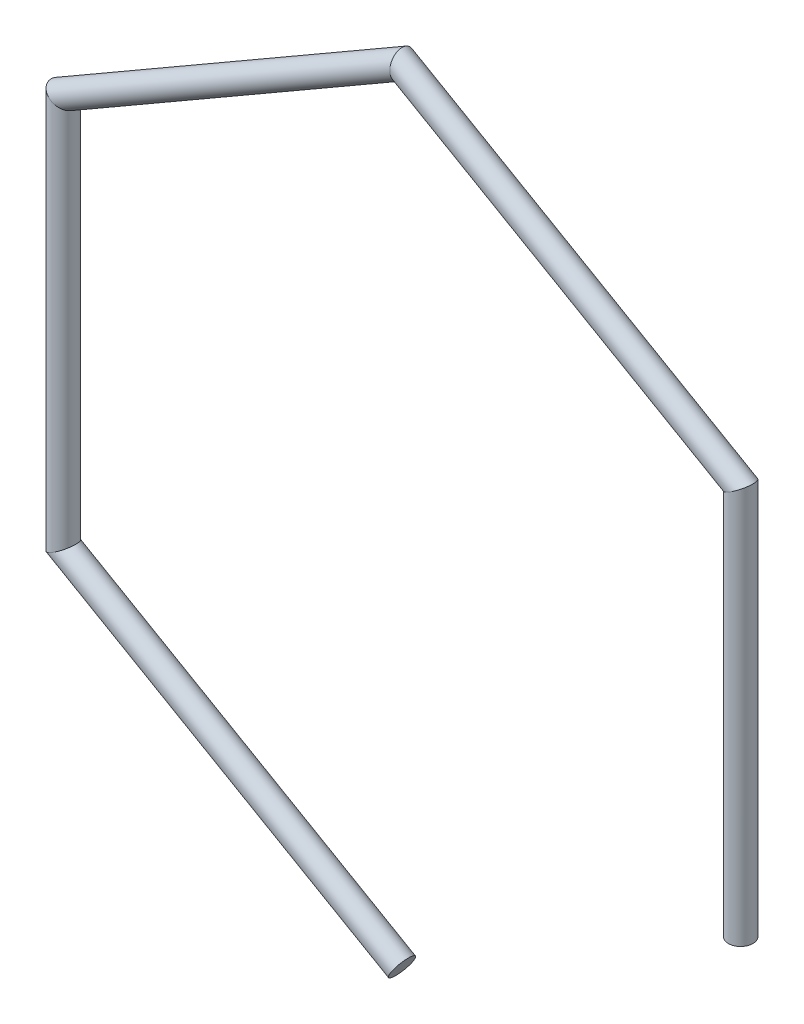
ISO-10303-21;
HEADER;
FILE_DESCRIPTION(('STEP AP214'),'2;1');
FILE_NAME('part.step','',(''),(''),'','','');
FILE_SCHEMA(('AUTOMOTIVE_DESIGN { 1 0 10303 214 1 1 1 1 }'));
ENDSEC;
DATA;
#1=APPLICATION_CONTEXT('core data for automotive mechanical design processes');
#2=APPLICATION_PROTOCOL_DEFINITION('international standard','automotive_design',2000,#1);
#3=PRODUCT_CONTEXT('',#1,'mechanical');
#4=PRODUCT('Part','Part','',(#3));
#5=PRODUCT_RELATED_PRODUCT_CATEGORY('part','',(#4));
#6=PRODUCT_DEFINITION_FORMATION('','',#4);
#7=PRODUCT_DEFINITION_CONTEXT('part definition',#1,'design');
#8=PRODUCT_DEFINITION('design','',#6,#7);
#9=PRODUCT_DEFINITION_SHAPE('','',#8);
#10=(LENGTH_UNIT() NAMED_UNIT(*) SI_UNIT(.MILLI.,.METRE.));
#11=(NAMED_UNIT(*) PLANE_ANGLE_UNIT() SI_UNIT($,.RADIAN.));
#12=(NAMED_UNIT(*) SI_UNIT($,.STERADIAN.) SOLID_ANGLE_UNIT());
#13=UNCERTAINTY_MEASURE_WITH_UNIT(LENGTH_MEASURE(1.E-05),#10,'distance_accuracy_value','');
#14=(GEOMETRIC_REPRESENTATION_CONTEXT(3) GLOBAL_UNCERTAINTY_ASSIGNED_CONTEXT((#13)) GLOBAL_UNIT_ASSIGNED_CONTEXT((#10,
#11,#12)) REPRESENTATION_CONTEXT('',''));
#15=CARTESIAN_POINT('',(0.,0.,0.));
#16=DIRECTION('',(0.,0.,1.));
#17=DIRECTION('',(1.,0.,0.));
#18=AXIS2_PLACEMENT_3D('',#15,#16,#17);
#19=CARTESIAN_POINT('',(0.,-8.,0.));
#20=DIRECTION('',(0.866025403784439,-0.5,0.));
#21=DIRECTION('',(0.,0.,1.));
#22=AXIS2_PLACEMENT_3D('',#19,#20,#21);
#23=PLANE('',#22);
#24=CARTESIAN_POINT('',(0.,-8.,0.));
#25=DIRECTION('',(0.866025403784439,-0.5,0.));
#26=DIRECTION('',(0.,0.,1.));
#27=AXIS2_PLACEMENT_3D('',#24,#25,#26);
#28=CIRCLE('',#27,0.25);
#29=CARTESIAN_POINT('',(0.,-8.,0.25));
#30=VERTEX_POINT('',#29);
#31=EDGE_CURVE('E40',#30,#30,#28,.T.);
#32=ORIENTED_EDGE('',*,*,#31,.T.);
#33=EDGE_LOOP('',(#32));
#34=FACE_BOUND('',#33,.T.);
#35=ADVANCED_FACE('F37',(#34),#23,.T.);
#36=CARTESIAN_POINT('',(6.92820323027549,-4.00000000000003,0.));
#37=DIRECTION('',(0.,1.,0.));
#38=DIRECTION('',(0.,0.,1.));
#39=AXIS2_PLACEMENT_3D('',#36,#37,#38);
#40=PLANE('',#39);
#41=CARTESIAN_POINT('',(6.92820323027549,-4.00000000000003,0.));
#42=DIRECTION('',(0.,1.,0.));
#43=DIRECTION('',(0.,0.,1.));
#44=AXIS2_PLACEMENT_3D('',#41,#42,#43);
#45=CIRCLE('',#44,0.25);
#46=CARTESIAN_POINT('',(6.92820323027549,-4.00000000000003,0.25));
#47=VERTEX_POINT('',#46);
#48=EDGE_CURVE('E45',#47,#47,#45,.T.);
#49=ORIENTED_EDGE('',*,*,#48,.F.);
#50=EDGE_LOOP('',(#49));
#51=FACE_BOUND('',#50,.T.);
#52=ADVANCED_FACE('F73',(#51),#40,.F.);
#53=CARTESIAN_POINT('',(-7.28980577065392,-3.79122867597287,0.));
#54=DIRECTION('',(0.866025403784439,-0.5,0.));
#55=DIRECTION('',(0.5,0.866025403784439,0.));
#56=AXIS2_PLACEMENT_3D('',#53,#54,#55);
#57=CYLINDRICAL_SURFACE('',#56,0.25);
#58=CARTESIAN_POINT('',(-6.92820323027551,-4.,0.));
#59=DIRECTION('',(0.5,-0.866025403784439,0.));
#60=DIRECTION('',(-0.866025403784439,-0.5,0.));
#61=AXIS2_PLACEMENT_3D('',#58,#59,#60);
#62=ELLIPSE('',#61,0.288675134594813,0.25);
#63=CARTESIAN_POINT('',(-7.17820323027551,-4.14433756729741,0.));
#64=VERTEX_POINT('',#63);
#65=EDGE_CURVE('E60',#64,#64,#62,.F.);
#66=ORIENTED_EDGE('',*,*,#65,.F.);
#67=EDGE_LOOP('',(#66));
#68=FACE_BOUND('',#67,.T.);
#69=ORIENTED_EDGE('',*,*,#31,.F.);
#70=EDGE_LOOP('',(#69));
#71=FACE_BOUND('',#70,.T.);
#72=ADVANCED_FACE('F70',(#68,#71),#57,.T.);
#73=CARTESIAN_POINT('',(-6.92820323027551,4.41754264805426,0.));
#74=DIRECTION('',(0.,-1.,0.));
#75=DIRECTION('',(1.,0.,0.));
#76=AXIS2_PLACEMENT_3D('',#73,#74,#75);
#77=CYLINDRICAL_SURFACE('',#76,0.25);
#78=CARTESIAN_POINT('',(-6.92820323027551,4.,0.));
#79=DIRECTION('',(-0.5,-0.866025403784439,0.));
#80=DIRECTION('',(-0.866025403784439,0.5,0.));
#81=AXIS2_PLACEMENT_3D('',#78,#79,#80);
#82=ELLIPSE('',#81,0.288675134594813,0.25);
#83=CARTESIAN_POINT('',(-7.17820323027551,4.14433756729741,0.));
#84=VERTEX_POINT('',#83);
#85=EDGE_CURVE('E57',#84,#84,#82,.F.);
#86=ORIENTED_EDGE('',*,*,#85,.F.);
#87=EDGE_LOOP('',(#86));
#88=FACE_BOUND('',#87,.T.);
#89=ORIENTED_EDGE('',*,*,#65,.T.);
#90=EDGE_LOOP('',(#89));
#91=FACE_BOUND('',#90,.T.);
#92=ADVANCED_FACE('F72',(#88,#91),#77,.T.);
#93=CARTESIAN_POINT('',(0.361602540378411,8.20877132402713,0.));
#94=DIRECTION('',(-0.866025403784439,-0.5,0.));
#95=DIRECTION('',(0.5,-0.866025403784439,0.));
#96=AXIS2_PLACEMENT_3D('',#93,#94,#95);
#97=CYLINDRICAL_SURFACE('',#96,0.25);
#98=CARTESIAN_POINT('',(0.,8.,0.));
#99=DIRECTION('',(-1.,0.,0.));
#100=DIRECTION('',(0.,1.,0.));
#101=AXIS2_PLACEMENT_3D('',#98,#99,#100);
#102=ELLIPSE('',#101,0.288675134594813,0.25);
#103=CARTESIAN_POINT('',(0.,8.28867513459481,0.));
#104=VERTEX_POINT('',#103);
#105=EDGE_CURVE('E51',#104,#104,#102,.F.);
#106=ORIENTED_EDGE('',*,*,#105,.F.);
#107=EDGE_LOOP('',(#106));
#108=FACE_BOUND('',#107,.T.);
#109=ORIENTED_EDGE('',*,*,#85,.T.);
#110=EDGE_LOOP('',(#109));
#111=FACE_BOUND('',#110,.T.);
#112=ADVANCED_FACE('F80',(#108,#111),#97,.T.);
#113=CARTESIAN_POINT('',(7.28980577065389,3.7912286759729,0.));
#114=DIRECTION('',(-0.866025403784439,0.5,0.));
#115=DIRECTION('',(-0.5,-0.866025403784439,0.));
#116=AXIS2_PLACEMENT_3D('',#113,#114,#115);
#117=CYLINDRICAL_SURFACE('',#116,0.25);
#118=CARTESIAN_POINT('',(6.92820323027549,4.00000000000001,0.));
#119=DIRECTION('',(-0.5,0.866025403784439,0.));
#120=DIRECTION('',(0.866025403784439,0.5,0.));
#121=AXIS2_PLACEMENT_3D('',#118,#119,#120);
#122=ELLIPSE('',#121,0.288675134594813,0.25);
#123=CARTESIAN_POINT('',(7.17820323027549,4.14433756729742,0.));
#124=VERTEX_POINT('',#123);
#125=EDGE_CURVE('E10',#124,#124,#122,.F.);
#126=ORIENTED_EDGE('',*,*,#125,.F.);
#127=EDGE_LOOP('',(#126));
#128=FACE_BOUND('',#127,.T.);
#129=ORIENTED_EDGE('',*,*,#105,.T.);
#130=EDGE_LOOP('',(#129));
#131=FACE_BOUND('',#130,.T.);
#132=ADVANCED_FACE('F86',(#128,#131),#117,.T.);
#133=CARTESIAN_POINT('',(6.92820323027549,-4.00000000000003,0.));
#134=DIRECTION('',(0.,1.,0.));
#135=DIRECTION('',(-1.,0.,0.));
#136=AXIS2_PLACEMENT_3D('',#133,#134,#135);
#137=CYLINDRICAL_SURFACE('',#136,0.25);
#138=ORIENTED_EDGE('',*,*,#48,.T.);
#139=EDGE_LOOP('',(#138));
#140=FACE_BOUND('',#139,.T.);
#141=ORIENTED_EDGE('',*,*,#125,.T.);
#142=EDGE_LOOP('',(#141));
#143=FACE_BOUND('',#142,.T.);
#144=ADVANCED_FACE('F84',(#140,#143),#137,.T.);
#145=CLOSED_SHELL('',(#35,#52,#72,#92,#112,#132,#144));
#146=MANIFOLD_SOLID_BREP('B2',#145);
#147=ADVANCED_BREP_SHAPE_REPRESENTATION('',(#18,#146),#14);
#148=SHAPE_DEFINITION_REPRESENTATION(#9,#147);
ENDSEC;
END-ISO-10303-21;
